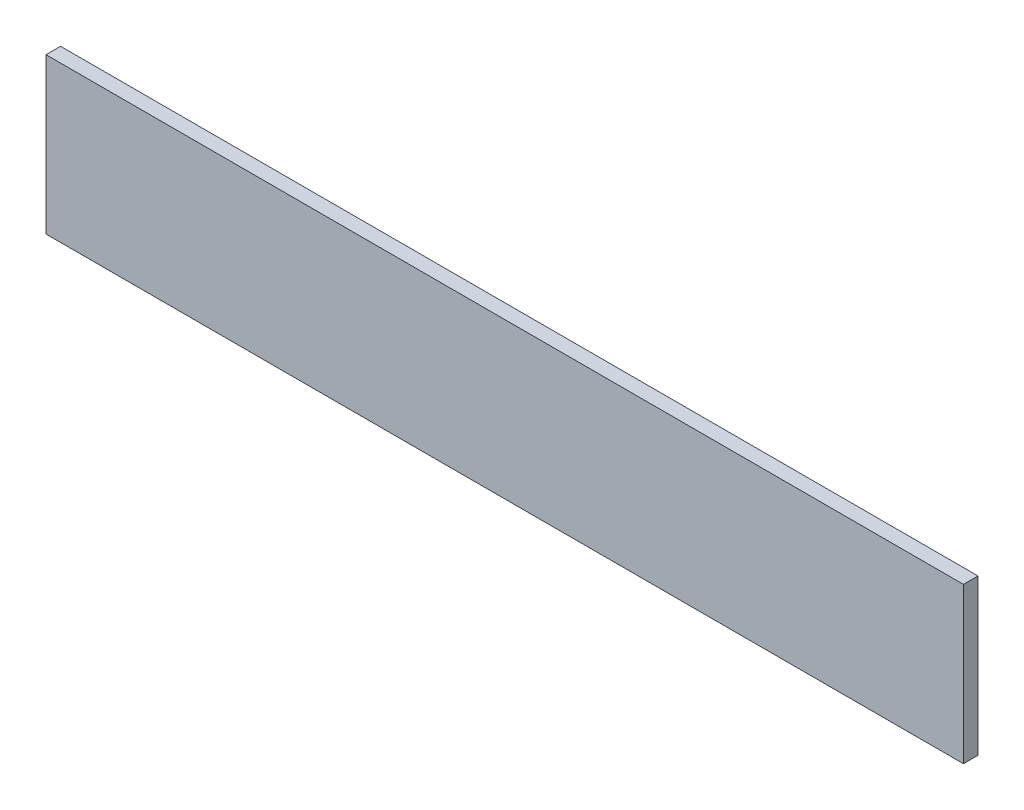
ISO-10303-21;
HEADER;
FILE_DESCRIPTION(('STEP AP214'),'2;1');
FILE_NAME('part.step','',(''),(''),'','','');
FILE_SCHEMA(('AUTOMOTIVE_DESIGN { 1 0 10303 214 1 1 1 1 }'));
ENDSEC;
DATA;
#1=APPLICATION_CONTEXT('core data for automotive mechanical design processes');
#2=APPLICATION_PROTOCOL_DEFINITION('international standard','automotive_design',2000,#1);
#3=PRODUCT_CONTEXT('',#1,'mechanical');
#4=PRODUCT('Part','Part','',(#3));
#5=PRODUCT_RELATED_PRODUCT_CATEGORY('part','',(#4));
#6=PRODUCT_DEFINITION_FORMATION('','',#4);
#7=PRODUCT_DEFINITION_CONTEXT('part definition',#1,'design');
#8=PRODUCT_DEFINITION('design','',#6,#7);
#9=PRODUCT_DEFINITION_SHAPE('','',#8);
#10=(LENGTH_UNIT() NAMED_UNIT(*) SI_UNIT(.MILLI.,.METRE.));
#11=(NAMED_UNIT(*) PLANE_ANGLE_UNIT() SI_UNIT($,.RADIAN.));
#12=(NAMED_UNIT(*) SI_UNIT($,.STERADIAN.) SOLID_ANGLE_UNIT());
#13=UNCERTAINTY_MEASURE_WITH_UNIT(LENGTH_MEASURE(1.E-05),#10,'distance_accuracy_value','');
#14=(GEOMETRIC_REPRESENTATION_CONTEXT(3) GLOBAL_UNCERTAINTY_ASSIGNED_CONTEXT((#13)) GLOBAL_UNIT_ASSIGNED_CONTEXT((#10,
#11,#12)) REPRESENTATION_CONTEXT('',''));
#15=CARTESIAN_POINT('',(0.,0.,0.));
#16=DIRECTION('',(0.,0.,1.));
#17=DIRECTION('',(1.,0.,0.));
#18=AXIS2_PLACEMENT_3D('',#15,#16,#17);
#19=CARTESIAN_POINT('',(94.5000000000001,16.,1.5));
#20=DIRECTION('',(-1.,0.,0.));
#21=DIRECTION('',(0.,-1.,0.));
#22=AXIS2_PLACEMENT_3D('',#19,#20,#21);
#23=PLANE('',#22);
#24=DIRECTION('',(0.,1.,0.));
#25=VECTOR('',#24,1.);
#26=CARTESIAN_POINT('',(94.5000000000001,16.,-1.5));
#27=LINE('',#26,#25);
#28=CARTESIAN_POINT('',(94.5000000000001,-16.,-1.5));
#29=VERTEX_POINT('',#28);
#30=CARTESIAN_POINT('',(94.5000000000001,16.,-1.5));
#31=VERTEX_POINT('',#30);
#32=EDGE_CURVE('E100',#29,#31,#27,.T.);
#33=ORIENTED_EDGE('',*,*,#32,.T.);
#34=DIRECTION('',(0.,0.,-1.));
#35=VECTOR('',#34,1.);
#36=CARTESIAN_POINT('',(94.5000000000001,16.,1.5));
#37=LINE('',#36,#35);
#38=CARTESIAN_POINT('',(94.5000000000001,16.,1.5));
#39=VERTEX_POINT('',#38);
#40=EDGE_CURVE('E11',#39,#31,#37,.T.);
#41=ORIENTED_EDGE('',*,*,#40,.F.);
#42=DIRECTION('',(0.,1.,0.));
#43=VECTOR('',#42,1.);
#44=CARTESIAN_POINT('',(94.5000000000001,16.,1.5));
#45=LINE('',#44,#43);
#46=CARTESIAN_POINT('',(94.5000000000001,-16.,1.5));
#47=VERTEX_POINT('',#46);
#48=EDGE_CURVE('E88',#47,#39,#45,.T.);
#49=ORIENTED_EDGE('',*,*,#48,.F.);
#50=DIRECTION('',(0.,0.,-1.));
#51=VECTOR('',#50,1.);
#52=CARTESIAN_POINT('',(94.5000000000001,-16.,1.5));
#53=LINE('',#52,#51);
#54=EDGE_CURVE('E96',#47,#29,#53,.T.);
#55=ORIENTED_EDGE('',*,*,#54,.T.);
#56=EDGE_LOOP('',(#33,#41,#49,#55));
#57=FACE_BOUND('',#56,.T.);
#58=ADVANCED_FACE('F37',(#57),#23,.F.);
#59=CARTESIAN_POINT('',(-94.4999999999999,16.,1.5));
#60=DIRECTION('',(0.,-1.,0.));
#61=DIRECTION('',(1.,0.,0.));
#62=AXIS2_PLACEMENT_3D('',#59,#60,#61);
#63=PLANE('',#62);
#64=DIRECTION('',(-1.,0.,0.));
#65=VECTOR('',#64,1.);
#66=CARTESIAN_POINT('',(-94.4999999999999,16.,-1.5));
#67=LINE('',#66,#65);
#68=CARTESIAN_POINT('',(-94.4999999999999,16.,-1.5));
#69=VERTEX_POINT('',#68);
#70=EDGE_CURVE('E92',#31,#69,#67,.T.);
#71=ORIENTED_EDGE('',*,*,#70,.T.);
#72=DIRECTION('',(0.,0.,-1.));
#73=VECTOR('',#72,1.);
#74=CARTESIAN_POINT('',(-94.4999999999999,16.,1.5));
#75=LINE('',#74,#73);
#76=CARTESIAN_POINT('',(-94.4999999999999,16.,1.5));
#77=VERTEX_POINT('',#76);
#78=EDGE_CURVE('E45',#77,#69,#75,.T.);
#79=ORIENTED_EDGE('',*,*,#78,.F.);
#80=DIRECTION('',(-1.,0.,0.));
#81=VECTOR('',#80,1.);
#82=CARTESIAN_POINT('',(-94.4999999999999,16.,1.5));
#83=LINE('',#82,#81);
#84=EDGE_CURVE('E83',#39,#77,#83,.T.);
#85=ORIENTED_EDGE('',*,*,#84,.F.);
#86=ORIENTED_EDGE('',*,*,#40,.T.);
#87=EDGE_LOOP('',(#71,#79,#85,#86));
#88=FACE_BOUND('',#87,.T.);
#89=ADVANCED_FACE('F91',(#88),#63,.F.);
#90=CARTESIAN_POINT('',(-94.4999999999999,16.,1.5));
#91=DIRECTION('',(1.,0.,0.));
#92=DIRECTION('',(0.,0.,-1.));
#93=AXIS2_PLACEMENT_3D('',#90,#91,#92);
#94=PLANE('',#93);
#95=DIRECTION('',(0.,-1.,0.));
#96=VECTOR('',#95,1.);
#97=CARTESIAN_POINT('',(-94.4999999999999,16.,-1.5));
#98=LINE('',#97,#96);
#99=CARTESIAN_POINT('',(-94.4999999999999,-16.,-1.5));
#100=VERTEX_POINT('',#99);
#101=EDGE_CURVE('E70',#69,#100,#98,.T.);
#102=ORIENTED_EDGE('',*,*,#101,.T.);
#103=DIRECTION('',(0.,0.,-1.));
#104=VECTOR('',#103,1.);
#105=CARTESIAN_POINT('',(-94.4999999999999,-16.,1.5));
#106=LINE('',#105,#104);
#107=CARTESIAN_POINT('',(-94.4999999999999,-16.,1.5));
#108=VERTEX_POINT('',#107);
#109=EDGE_CURVE('E93',#108,#100,#106,.T.);
#110=ORIENTED_EDGE('',*,*,#109,.F.);
#111=DIRECTION('',(0.,-1.,0.));
#112=VECTOR('',#111,1.);
#113=CARTESIAN_POINT('',(-94.4999999999999,16.,1.5));
#114=LINE('',#113,#112);
#115=EDGE_CURVE('E86',#77,#108,#114,.T.);
#116=ORIENTED_EDGE('',*,*,#115,.F.);
#117=ORIENTED_EDGE('',*,*,#78,.T.);
#118=EDGE_LOOP('',(#102,#110,#116,#117));
#119=FACE_BOUND('',#118,.T.);
#120=ADVANCED_FACE('F94',(#119),#94,.F.);
#121=CARTESIAN_POINT('',(-94.4999999999999,-16.,1.5));
#122=DIRECTION('',(0.,1.,0.));
#123=DIRECTION('',(0.,0.,1.));
#124=AXIS2_PLACEMENT_3D('',#121,#122,#123);
#125=PLANE('',#124);
#126=DIRECTION('',(1.,0.,0.));
#127=VECTOR('',#126,1.);
#128=CARTESIAN_POINT('',(-94.4999999999999,-16.,-1.5));
#129=LINE('',#128,#127);
#130=EDGE_CURVE('E76',#100,#29,#129,.T.);
#131=ORIENTED_EDGE('',*,*,#130,.T.);
#132=ORIENTED_EDGE('',*,*,#54,.F.);
#133=DIRECTION('',(1.,0.,0.));
#134=VECTOR('',#133,1.);
#135=CARTESIAN_POINT('',(-94.4999999999999,-16.,1.5));
#136=LINE('',#135,#134);
#137=EDGE_CURVE('E53',#108,#47,#136,.T.);
#138=ORIENTED_EDGE('',*,*,#137,.F.);
#139=ORIENTED_EDGE('',*,*,#109,.T.);
#140=EDGE_LOOP('',(#131,#132,#138,#139));
#141=FACE_BOUND('',#140,.T.);
#142=ADVANCED_FACE('F107',(#141),#125,.F.);
#143=CARTESIAN_POINT('',(0.,0.,1.5));
#144=DIRECTION('',(0.,0.,1.));
#145=DIRECTION('',(1.,0.,0.));
#146=AXIS2_PLACEMENT_3D('',#143,#144,#145);
#147=PLANE('',#146);
#148=ORIENTED_EDGE('',*,*,#48,.T.);
#149=ORIENTED_EDGE('',*,*,#84,.T.);
#150=ORIENTED_EDGE('',*,*,#115,.T.);
#151=ORIENTED_EDGE('',*,*,#137,.T.);
#152=EDGE_LOOP('',(#148,#149,#150,#151));
#153=FACE_BOUND('',#152,.T.);
#154=ADVANCED_FACE('F84',(#153),#147,.T.);
#155=CARTESIAN_POINT('',(0.,0.,-1.5));
#156=DIRECTION('',(0.,0.,1.));
#157=DIRECTION('',(1.,0.,0.));
#158=AXIS2_PLACEMENT_3D('',#155,#156,#157);
#159=PLANE('',#158);
#160=ORIENTED_EDGE('',*,*,#32,.F.);
#161=ORIENTED_EDGE('',*,*,#130,.F.);
#162=ORIENTED_EDGE('',*,*,#101,.F.);
#163=ORIENTED_EDGE('',*,*,#70,.F.);
#164=EDGE_LOOP('',(#160,#161,#162,#163));
#165=FACE_BOUND('',#164,.T.);
#166=ADVANCED_FACE('F110',(#165),#159,.F.);
#167=CLOSED_SHELL('',(#58,#89,#120,#142,#154,#166));
#168=MANIFOLD_SOLID_BREP('B2',#167);
#169=ADVANCED_BREP_SHAPE_REPRESENTATION('',(#18,#168),#14);
#170=SHAPE_DEFINITION_REPRESENTATION(#9,#169);
ENDSEC;
END-ISO-10303-21;
